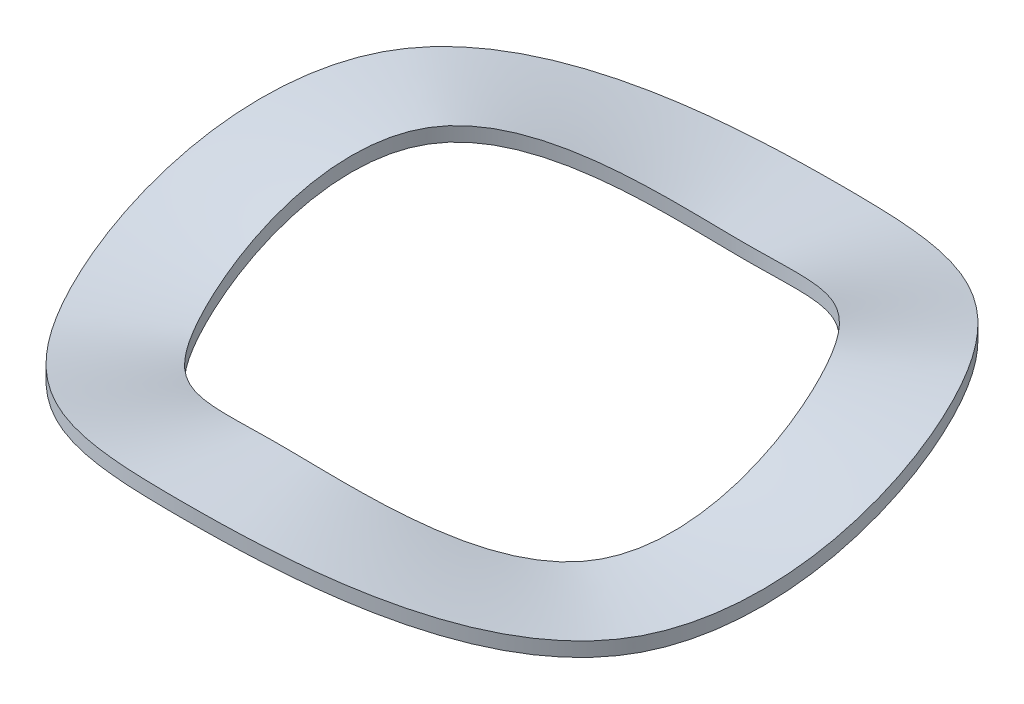
ISO-10303-21;
HEADER;
FILE_DESCRIPTION(('STEP AP214'),'2;1');
FILE_NAME('part.step','',(''),(''),'','','');
FILE_SCHEMA(('AUTOMOTIVE_DESIGN { 1 0 10303 214 1 1 1 1 }'));
ENDSEC;
DATA;
#1=APPLICATION_CONTEXT('core data for automotive mechanical design processes');
#2=APPLICATION_PROTOCOL_DEFINITION('international standard','automotive_design',2000,#1);
#3=PRODUCT_CONTEXT('',#1,'mechanical');
#4=PRODUCT('Part','Part','',(#3));
#5=PRODUCT_RELATED_PRODUCT_CATEGORY('part','',(#4));
#6=PRODUCT_DEFINITION_FORMATION('','',#4);
#7=PRODUCT_DEFINITION_CONTEXT('part definition',#1,'design');
#8=PRODUCT_DEFINITION('design','',#6,#7);
#9=PRODUCT_DEFINITION_SHAPE('','',#8);
#10=(LENGTH_UNIT() NAMED_UNIT(*) SI_UNIT(.MILLI.,.METRE.));
#11=(NAMED_UNIT(*) PLANE_ANGLE_UNIT() SI_UNIT($,.RADIAN.));
#12=(NAMED_UNIT(*) SI_UNIT($,.STERADIAN.) SOLID_ANGLE_UNIT());
#13=UNCERTAINTY_MEASURE_WITH_UNIT(LENGTH_MEASURE(1.E-05),#10,'distance_accuracy_value','');
#14=(GEOMETRIC_REPRESENTATION_CONTEXT(3) GLOBAL_UNCERTAINTY_ASSIGNED_CONTEXT((#13)) GLOBAL_UNIT_ASSIGNED_CONTEXT((#10,
#11,#12)) REPRESENTATION_CONTEXT('',''));
#15=CARTESIAN_POINT('',(0.,0.,0.));
#16=DIRECTION('',(0.,0.,1.));
#17=DIRECTION('',(1.,0.,0.));
#18=AXIS2_PLACEMENT_3D('',#15,#16,#17);
#19=CARTESIAN_POINT('',(0.,0.,-9.398));
#20=CARTESIAN_POINT('',(3.25556269790646,0.,-9.39799999999999));
#21=CARTESIAN_POINT('',(9.7666880937194,3.2512,-5.6388));
#22=CARTESIAN_POINT('',(9.76668809371935,-1.6256,5.63880000000003));
#23=CARTESIAN_POINT('',(0.,3.25119999999999,11.2776));
#24=CARTESIAN_POINT('',(-9.76668809371943,-1.6256,5.63879999999996));
#25=CARTESIAN_POINT('',(-9.76668809371936,1.6256,-1.87960000000004));
#26=CARTESIAN_POINT('',(-6.5111253958129,1.6256,-7.51840000000004));
#27=CARTESIAN_POINT('',(-3.25556269790646,0.,-9.39800000000001));
#28=CARTESIAN_POINT('',(0.,0.,-9.398));
#29=CARTESIAN_POINT('',(0.,0.135466666666667,-9.398));
#30=CARTESIAN_POINT('',(3.25556269790646,0.135466666666667,-9.39799999999999));
#31=CARTESIAN_POINT('',(9.7666880937194,3.38666666666667,-5.6388));
#32=CARTESIAN_POINT('',(9.76668809371935,-1.49013333333333,5.63880000000003));
#33=CARTESIAN_POINT('',(0.,3.38666666666666,11.2776));
#34=CARTESIAN_POINT('',(-9.76668809371943,-1.49013333333333,5.63879999999996));
#35=CARTESIAN_POINT('',(-9.76668809371936,1.76106666666666,-1.87960000000004));
#36=CARTESIAN_POINT('',(-6.5111253958129,1.76106666666667,-7.51840000000004));
#37=CARTESIAN_POINT('',(-3.25556269790646,0.135466666666667,-9.39800000000001));
#38=CARTESIAN_POINT('',(0.,0.135466666666667,-9.398));
#39=CARTESIAN_POINT('',(0.,0.270933333333333,-9.398));
#40=CARTESIAN_POINT('',(3.25556269790646,0.270933333333333,-9.39799999999999));
#41=CARTESIAN_POINT('',(9.7666880937194,3.52213333333333,-5.6388));
#42=CARTESIAN_POINT('',(9.76668809371935,-1.35466666666667,5.63880000000003));
#43=CARTESIAN_POINT('',(0.,3.52213333333333,11.2776));
#44=CARTESIAN_POINT('',(-9.76668809371943,-1.35466666666667,5.63879999999996));
#45=CARTESIAN_POINT('',(-9.76668809371936,1.89653333333333,-1.87960000000004));
#46=CARTESIAN_POINT('',(-6.5111253958129,1.89653333333334,-7.51840000000004));
#47=CARTESIAN_POINT('',(-3.25556269790646,0.270933333333333,-9.39800000000001));
#48=CARTESIAN_POINT('',(0.,0.270933333333333,-9.398));
#49=CARTESIAN_POINT('',(0.,0.4064,-9.398));
#50=CARTESIAN_POINT('',(3.25556269790646,0.4064,-9.39799999999999));
#51=CARTESIAN_POINT('',(9.7666880937194,3.6576,-5.6388));
#52=CARTESIAN_POINT('',(9.76668809371935,-1.2192,5.63880000000003));
#53=CARTESIAN_POINT('',(0.,3.65759999999999,11.2776));
#54=CARTESIAN_POINT('',(-9.76668809371943,-1.2192,5.63879999999996));
#55=CARTESIAN_POINT('',(-9.76668809371936,2.032,-1.87960000000004));
#56=CARTESIAN_POINT('',(-6.5111253958129,2.032,-7.51840000000004));
#57=CARTESIAN_POINT('',(-3.25556269790646,0.4064,-9.39800000000001));
#58=CARTESIAN_POINT('',(0.,0.4064,-9.398));
#59=B_SPLINE_SURFACE_WITH_KNOTS('',3,3,((#19,#20,#21,#22,#23,#24,#25,#26,#27,#28),(#29,#30,#31,
#32,#33,#34,#35,#36,#37,#38),(#39,#40,#41,#42,#43,#44,#45,#46,#47,#48),(#49,#50,#51,#52,#53,#54,
#55,#56,#57,#58)),.UNSPECIFIED.,.F.,.T.,.F.,(4,4),(4,1,1,1,1,2,4),(0.,1.),(0.,0.166666666666667,
0.333333333333334,0.5,0.666666666666666,0.833333333333333,1.),.UNSPECIFIED.);
#60=CARTESIAN_POINT('',(0.,0.,-9.398));
#61=CARTESIAN_POINT('',(3.25556269790646,0.,-9.39799999999999));
#62=CARTESIAN_POINT('',(9.7666880937194,3.2512,-5.6388));
#63=CARTESIAN_POINT('',(9.76668809371935,-1.6256,5.63880000000003));
#64=CARTESIAN_POINT('',(0.,3.25119999999999,11.2776));
#65=CARTESIAN_POINT('',(-9.76668809371943,-1.6256,5.63879999999996));
#66=CARTESIAN_POINT('',(-9.76668809371936,1.6256,-1.87960000000004));
#67=CARTESIAN_POINT('',(-6.5111253958129,1.6256,-7.51840000000004));
#68=CARTESIAN_POINT('',(-3.25556269790646,0.,-9.39800000000001));
#69=CARTESIAN_POINT('',(0.,0.,-9.398));
#70=B_SPLINE_CURVE_WITH_KNOTS('',3,(#60,#61,#62,#63,#64,#65,#66,#67,#68,#69),.UNSPECIFIED.,.T.,
.F.,(4,1,1,1,1,2,4),(0.,0.166666666666667,0.333333333333334,0.5,0.666666666666666,
0.833333333333333,1.),.UNSPECIFIED.);
#71=CARTESIAN_POINT('',(0.,0.,-9.398));
#72=VERTEX_POINT('',#71);
#73=EDGE_CURVE('E11',#72,#72,#70,.F.);
#74=CARTESIAN_POINT('',(0.,0.4064,-9.398));
#75=CARTESIAN_POINT('',(3.25556269790646,0.4064,-9.39799999999999));
#76=CARTESIAN_POINT('',(9.7666880937194,3.6576,-5.6388));
#77=CARTESIAN_POINT('',(9.76668809371935,-1.2192,5.63880000000003));
#78=CARTESIAN_POINT('',(0.,3.65759999999999,11.2776));
#79=CARTESIAN_POINT('',(-9.76668809371943,-1.2192,5.63879999999996));
#80=CARTESIAN_POINT('',(-9.76668809371936,2.032,-1.87960000000004));
#81=CARTESIAN_POINT('',(-6.5111253958129,2.032,-7.51840000000004));
#82=CARTESIAN_POINT('',(-3.25556269790646,0.4064,-9.39800000000001));
#83=CARTESIAN_POINT('',(0.,0.4064,-9.398));
#84=B_SPLINE_CURVE_WITH_KNOTS('',3,(#74,#75,#76,#77,#78,#79,#80,#81,#82,#83),.UNSPECIFIED.,.T.,
.F.,(4,1,1,1,1,2,4),(0.,0.166666666666667,0.333333333333334,0.5,0.666666666666666,
0.833333333333333,1.),.UNSPECIFIED.);
#85=CARTESIAN_POINT('',(0.,0.4064,-9.398));
#86=VERTEX_POINT('',#85);
#87=EDGE_CURVE('E54',#86,#86,#84,.T.);
#88=ORIENTED_EDGE('',*,*,#73,.T.);
#89=EDGE_LOOP('',(#88));
#90=FACE_BOUND('',#89,.T.);
#91=ORIENTED_EDGE('',*,*,#87,.T.);
#92=EDGE_LOOP('',(#91));
#93=FACE_BOUND('',#92,.T.);
#94=ADVANCED_FACE('F42',(#90,#93),#59,.T.);
#95=CARTESIAN_POINT('',(0.,0.,-6.604));
#96=CARTESIAN_POINT('',(2.28769270663697,0.,-6.60399999999999));
#97=CARTESIAN_POINT('',(6.86307811991093,3.2512,-3.9624));
#98=CARTESIAN_POINT('',(6.86307811991089,-1.6256,3.96240000000002));
#99=CARTESIAN_POINT('',(0.,3.25119999999999,7.9248));
#100=CARTESIAN_POINT('',(-6.86307811991095,-1.6256,3.96239999999997));
#101=CARTESIAN_POINT('',(-6.8630781199109,1.6256,-1.32080000000003));
#102=CARTESIAN_POINT('',(-4.57538541327393,1.6256,-5.28320000000003));
#103=CARTESIAN_POINT('',(-2.28769270663697,0.,-6.60400000000001));
#104=CARTESIAN_POINT('',(0.,0.,-6.604));
#105=CARTESIAN_POINT('',(0.,0.,-7.53533333333334));
#106=CARTESIAN_POINT('',(2.61031603706013,0.,-7.53533333333333));
#107=CARTESIAN_POINT('',(7.83094811118042,3.2512,-4.5212));
#108=CARTESIAN_POINT('',(7.83094811118038,-1.6256,4.52120000000002));
#109=CARTESIAN_POINT('',(0.,3.25119999999999,9.0424));
#110=CARTESIAN_POINT('',(-7.83094811118044,-1.6256,4.52119999999997));
#111=CARTESIAN_POINT('',(-7.83094811118039,1.6256,-1.5070666666667));
#112=CARTESIAN_POINT('',(-5.22063207412025,1.6256,-6.0282666666667));
#113=CARTESIAN_POINT('',(-2.61031603706013,0.,-7.53533333333335));
#114=CARTESIAN_POINT('',(0.,0.,-7.53533333333334));
#115=CARTESIAN_POINT('',(0.,0.,-8.46666666666667));
#116=CARTESIAN_POINT('',(2.9329393674833,0.,-8.46666666666666));
#117=CARTESIAN_POINT('',(8.79881810244991,3.2512,-5.08));
#118=CARTESIAN_POINT('',(8.79881810244987,-1.6256,5.08000000000002));
#119=CARTESIAN_POINT('',(0.,3.25119999999999,10.16));
#120=CARTESIAN_POINT('',(-8.79881810244994,-1.6256,5.07999999999996));
#121=CARTESIAN_POINT('',(-8.79881810244988,1.6256,-1.69333333333337));
#122=CARTESIAN_POINT('',(-5.86587873496657,1.6256,-6.77333333333337));
#123=CARTESIAN_POINT('',(-2.9329393674833,0.,-8.46666666666668));
#124=CARTESIAN_POINT('',(0.,0.,-8.46666666666667));
#125=CARTESIAN_POINT('',(0.,0.,-9.398));
#126=CARTESIAN_POINT('',(3.25556269790646,0.,-9.39799999999999));
#127=CARTESIAN_POINT('',(9.7666880937194,3.2512,-5.6388));
#128=CARTESIAN_POINT('',(9.76668809371935,-1.6256,5.63880000000003));
#129=CARTESIAN_POINT('',(0.,3.25119999999999,11.2776));
#130=CARTESIAN_POINT('',(-9.76668809371943,-1.6256,5.63879999999996));
#131=CARTESIAN_POINT('',(-9.76668809371936,1.6256,-1.87960000000004));
#132=CARTESIAN_POINT('',(-6.5111253958129,1.6256,-7.51840000000004));
#133=CARTESIAN_POINT('',(-3.25556269790646,0.,-9.39800000000001));
#134=CARTESIAN_POINT('',(0.,0.,-9.398));
#135=B_SPLINE_SURFACE_WITH_KNOTS('',3,3,((#95,#96,#97,#98,#99,#100,#101,#102,#103,#104),(#105,
#106,#107,#108,#109,#110,#111,#112,#113,#114),(#115,#116,#117,#118,#119,#120,#121,#122,#123,
#124),(#125,#126,#127,#128,#129,#130,#131,#132,#133,#134)),.UNSPECIFIED.,.F.,.T.,.F.,(4,4),(4,1,
1,1,1,2,4),(0.,1.),(0.,0.166666666666667,0.333333333333334,0.5,0.666666666666666,
0.833333333333333,1.),.UNSPECIFIED.);
#136=CARTESIAN_POINT('',(0.,0.,-6.604));
#137=CARTESIAN_POINT('',(2.28769270663697,0.,-6.60399999999999));
#138=CARTESIAN_POINT('',(6.86307811991093,3.2512,-3.9624));
#139=CARTESIAN_POINT('',(6.86307811991089,-1.6256,3.96240000000002));
#140=CARTESIAN_POINT('',(0.,3.2512,7.9248));
#141=CARTESIAN_POINT('',(-6.86307811991095,-1.6256,3.96239999999997));
#142=CARTESIAN_POINT('',(-6.86307811991091,1.6256,-1.32080000000003));
#143=CARTESIAN_POINT('',(-4.57538541327393,1.6256,-5.28320000000003));
#144=CARTESIAN_POINT('',(-2.28769270663697,0.,-6.60400000000001));
#145=CARTESIAN_POINT('',(0.,0.,-6.604));
#146=B_SPLINE_CURVE_WITH_KNOTS('',3,(#136,#137,#138,#139,#140,#141,#142,#143,#144,#145),
.UNSPECIFIED.,.T.,.F.,(4,1,1,1,1,2,4),(0.,0.166666666666667,0.333333333333334,0.5,
0.666666666666666,0.833333333333333,1.),.UNSPECIFIED.);
#147=CARTESIAN_POINT('',(0.,0.,-6.604));
#148=VERTEX_POINT('',#147);
#149=EDGE_CURVE('E48',#148,#148,#146,.T.);
#150=ORIENTED_EDGE('',*,*,#149,.F.);
#151=EDGE_LOOP('',(#150));
#152=FACE_BOUND('',#151,.T.);
#153=ORIENTED_EDGE('',*,*,#73,.F.);
#154=EDGE_LOOP('',(#153));
#155=FACE_BOUND('',#154,.T.);
#156=ADVANCED_FACE('F83',(#152,#155),#135,.T.);
#157=CARTESIAN_POINT('',(0.,0.4064,-9.398));
#158=CARTESIAN_POINT('',(3.25556269790646,0.4064,-9.39799999999999));
#159=CARTESIAN_POINT('',(9.7666880937194,3.6576,-5.6388));
#160=CARTESIAN_POINT('',(9.76668809371935,-1.2192,5.63880000000003));
#161=CARTESIAN_POINT('',(0.,3.65759999999999,11.2776));
#162=CARTESIAN_POINT('',(-9.76668809371943,-1.2192,5.63879999999996));
#163=CARTESIAN_POINT('',(-9.76668809371936,2.032,-1.87960000000004));
#164=CARTESIAN_POINT('',(-6.5111253958129,2.032,-7.51840000000004));
#165=CARTESIAN_POINT('',(-3.25556269790646,0.4064,-9.39800000000001));
#166=CARTESIAN_POINT('',(0.,0.4064,-9.398));
#167=CARTESIAN_POINT('',(0.,0.406399999999999,-8.46666666666667));
#168=CARTESIAN_POINT('',(2.9329393674833,0.406399999999999,-8.46666666666666));
#169=CARTESIAN_POINT('',(8.79881810244991,3.6576,-5.08));
#170=CARTESIAN_POINT('',(8.79881810244987,-1.2192,5.08000000000003));
#171=CARTESIAN_POINT('',(0.,3.6576,10.16));
#172=CARTESIAN_POINT('',(-8.79881810244994,-1.2192,5.07999999999996));
#173=CARTESIAN_POINT('',(-8.79881810244988,2.032,-1.69333333333337));
#174=CARTESIAN_POINT('',(-5.86587873496657,2.032,-6.77333333333337));
#175=CARTESIAN_POINT('',(-2.9329393674833,0.4064,-8.46666666666668));
#176=CARTESIAN_POINT('',(0.,0.406399999999999,-8.46666666666667));
#177=CARTESIAN_POINT('',(0.,0.406399999999999,-7.53533333333333));
#178=CARTESIAN_POINT('',(2.61031603706013,0.406399999999999,-7.53533333333333));
#179=CARTESIAN_POINT('',(7.83094811118042,3.6576,-4.5212));
#180=CARTESIAN_POINT('',(7.83094811118038,-1.2192,4.52120000000002));
#181=CARTESIAN_POINT('',(0.,3.6576,9.0424));
#182=CARTESIAN_POINT('',(-7.83094811118044,-1.2192,4.52119999999997));
#183=CARTESIAN_POINT('',(-7.83094811118039,2.032,-1.5070666666667));
#184=CARTESIAN_POINT('',(-5.22063207412025,2.032,-6.02826666666669));
#185=CARTESIAN_POINT('',(-2.61031603706013,0.406399999999999,-7.53533333333334));
#186=CARTESIAN_POINT('',(0.,0.406399999999999,-7.53533333333333));
#187=CARTESIAN_POINT('',(0.,0.406399999999999,-6.604));
#188=CARTESIAN_POINT('',(2.28769270663697,0.406399999999999,-6.60399999999999));
#189=CARTESIAN_POINT('',(6.86307811991093,3.6576,-3.9624));
#190=CARTESIAN_POINT('',(6.8630781199109,-1.2192,3.96240000000002));
#191=CARTESIAN_POINT('',(0.,3.6576,7.9248));
#192=CARTESIAN_POINT('',(-6.86307811991095,-1.2192,3.96239999999997));
#193=CARTESIAN_POINT('',(-6.8630781199109,2.032,-1.32080000000003));
#194=CARTESIAN_POINT('',(-4.57538541327393,2.032,-5.28320000000003));
#195=CARTESIAN_POINT('',(-2.28769270663697,0.406399999999999,-6.60400000000001));
#196=CARTESIAN_POINT('',(0.,0.406399999999999,-6.604));
#197=B_SPLINE_SURFACE_WITH_KNOTS('',3,3,((#157,#158,#159,#160,#161,#162,#163,#164,#165,#166),
(#167,#168,#169,#170,#171,#172,#173,#174,#175,#176),(#177,#178,#179,#180,#181,#182,#183,#184,
#185,#186),(#187,#188,#189,#190,#191,#192,#193,#194,#195,#196)),.UNSPECIFIED.,.F.,.T.,.F.,(4,4),
(4,1,1,1,1,2,4),(0.,1.),(0.,0.166666666666667,0.333333333333334,0.5,0.666666666666666,
0.833333333333333,1.),.UNSPECIFIED.);
#198=CARTESIAN_POINT('',(0.,0.406399999999999,-6.604));
#199=CARTESIAN_POINT('',(2.28769270663697,0.406399999999999,-6.60399999999999));
#200=CARTESIAN_POINT('',(6.86307811991093,3.6576,-3.9624));
#201=CARTESIAN_POINT('',(6.8630781199109,-1.2192,3.96240000000002));
#202=CARTESIAN_POINT('',(0.,3.6576,7.9248));
#203=CARTESIAN_POINT('',(-6.86307811991095,-1.2192,3.96239999999997));
#204=CARTESIAN_POINT('',(-6.8630781199109,2.032,-1.32080000000003));
#205=CARTESIAN_POINT('',(-4.57538541327393,2.032,-5.28320000000003));
#206=CARTESIAN_POINT('',(-2.28769270663697,0.406399999999999,-6.60400000000001));
#207=CARTESIAN_POINT('',(0.,0.406399999999999,-6.604));
#208=B_SPLINE_CURVE_WITH_KNOTS('',3,(#198,#199,#200,#201,#202,#203,#204,#205,#206,#207),
.UNSPECIFIED.,.T.,.F.,(4,1,1,1,1,2,4),(0.,0.166666666666667,0.333333333333334,0.5,
0.666666666666666,0.833333333333333,1.),.UNSPECIFIED.);
#209=CARTESIAN_POINT('',(0.,0.406399999999999,-6.604));
#210=VERTEX_POINT('',#209);
#211=EDGE_CURVE('E59',#210,#210,#208,.T.);
#212=ORIENTED_EDGE('',*,*,#87,.F.);
#213=EDGE_LOOP('',(#212));
#214=FACE_BOUND('',#213,.T.);
#215=ORIENTED_EDGE('',*,*,#211,.T.);
#216=EDGE_LOOP('',(#215));
#217=FACE_BOUND('',#216,.T.);
#218=ADVANCED_FACE('F86',(#214,#217),#197,.T.);
#219=CARTESIAN_POINT('',(0.,0.406399999999999,-6.604));
#220=CARTESIAN_POINT('',(2.28769270663697,0.406399999999999,-6.60399999999999));
#221=CARTESIAN_POINT('',(6.86307811991093,3.6576,-3.9624));
#222=CARTESIAN_POINT('',(6.8630781199109,-1.2192,3.96240000000002));
#223=CARTESIAN_POINT('',(0.,3.6576,7.9248));
#224=CARTESIAN_POINT('',(-6.86307811991095,-1.2192,3.96239999999997));
#225=CARTESIAN_POINT('',(-6.86307811991091,2.032,-1.32080000000003));
#226=CARTESIAN_POINT('',(-4.57538541327393,2.032,-5.28320000000003));
#227=CARTESIAN_POINT('',(-2.28769270663697,0.406399999999999,-6.60400000000001));
#228=CARTESIAN_POINT('',(0.,0.406399999999999,-6.604));
#229=CARTESIAN_POINT('',(0.,0.270933333333333,-6.604));
#230=CARTESIAN_POINT('',(2.28769270663697,0.270933333333333,-6.60399999999999));
#231=CARTESIAN_POINT('',(6.86307811991093,3.52213333333334,-3.9624));
#232=CARTESIAN_POINT('',(6.86307811991089,-1.35466666666667,3.96240000000002));
#233=CARTESIAN_POINT('',(0.,3.52213333333333,7.9248));
#234=CARTESIAN_POINT('',(-6.86307811991095,-1.35466666666667,3.96239999999997));
#235=CARTESIAN_POINT('',(-6.86307811991091,1.89653333333333,-1.32080000000003));
#236=CARTESIAN_POINT('',(-4.57538541327393,1.89653333333334,-5.28320000000003));
#237=CARTESIAN_POINT('',(-2.28769270663697,0.270933333333333,-6.60400000000001));
#238=CARTESIAN_POINT('',(0.,0.270933333333333,-6.604));
#239=CARTESIAN_POINT('',(0.,0.135466666666667,-6.604));
#240=CARTESIAN_POINT('',(2.28769270663697,0.135466666666667,-6.60399999999999));
#241=CARTESIAN_POINT('',(6.86307811991093,3.38666666666667,-3.9624));
#242=CARTESIAN_POINT('',(6.86307811991089,-1.49013333333333,3.96240000000002));
#243=CARTESIAN_POINT('',(0.,3.38666666666666,7.9248));
#244=CARTESIAN_POINT('',(-6.86307811991095,-1.49013333333333,3.96239999999997));
#245=CARTESIAN_POINT('',(-6.86307811991091,1.76106666666666,-1.32080000000003));
#246=CARTESIAN_POINT('',(-4.57538541327393,1.76106666666667,-5.28320000000003));
#247=CARTESIAN_POINT('',(-2.28769270663697,0.135466666666667,-6.60400000000001));
#248=CARTESIAN_POINT('',(0.,0.135466666666667,-6.604));
#249=CARTESIAN_POINT('',(0.,0.,-6.604));
#250=CARTESIAN_POINT('',(2.28769270663697,0.,-6.60399999999999));
#251=CARTESIAN_POINT('',(6.86307811991093,3.2512,-3.9624));
#252=CARTESIAN_POINT('',(6.86307811991089,-1.6256,3.96240000000002));
#253=CARTESIAN_POINT('',(0.,3.2512,7.9248));
#254=CARTESIAN_POINT('',(-6.86307811991095,-1.6256,3.96239999999997));
#255=CARTESIAN_POINT('',(-6.86307811991091,1.6256,-1.32080000000003));
#256=CARTESIAN_POINT('',(-4.57538541327393,1.6256,-5.28320000000003));
#257=CARTESIAN_POINT('',(-2.28769270663697,0.,-6.60400000000001));
#258=CARTESIAN_POINT('',(0.,0.,-6.604));
#259=B_SPLINE_SURFACE_WITH_KNOTS('',3,3,((#219,#220,#221,#222,#223,#224,#225,#226,#227,#228),
(#229,#230,#231,#232,#233,#234,#235,#236,#237,#238),(#239,#240,#241,#242,#243,#244,#245,#246,
#247,#248),(#249,#250,#251,#252,#253,#254,#255,#256,#257,#258)),.UNSPECIFIED.,.F.,.T.,.F.,(4,4),
(4,1,1,1,1,2,4),(0.,1.),(0.,0.166666666666667,0.333333333333334,0.5,0.666666666666666,
0.833333333333333,1.),.UNSPECIFIED.);
#260=ORIENTED_EDGE('',*,*,#211,.F.);
#261=EDGE_LOOP('',(#260));
#262=FACE_BOUND('',#261,.T.);
#263=ORIENTED_EDGE('',*,*,#149,.T.);
#264=EDGE_LOOP('',(#263));
#265=FACE_BOUND('',#264,.T.);
#266=ADVANCED_FACE('F44',(#262,#265),#259,.T.);
#267=CLOSED_SHELL('',(#94,#156,#218,#266));
#268=MANIFOLD_SOLID_BREP('B2',#267);
#269=ADVANCED_BREP_SHAPE_REPRESENTATION('',(#18,#268),#14);
#270=SHAPE_DEFINITION_REPRESENTATION(#9,#269);
ENDSEC;
END-ISO-10303-21;
